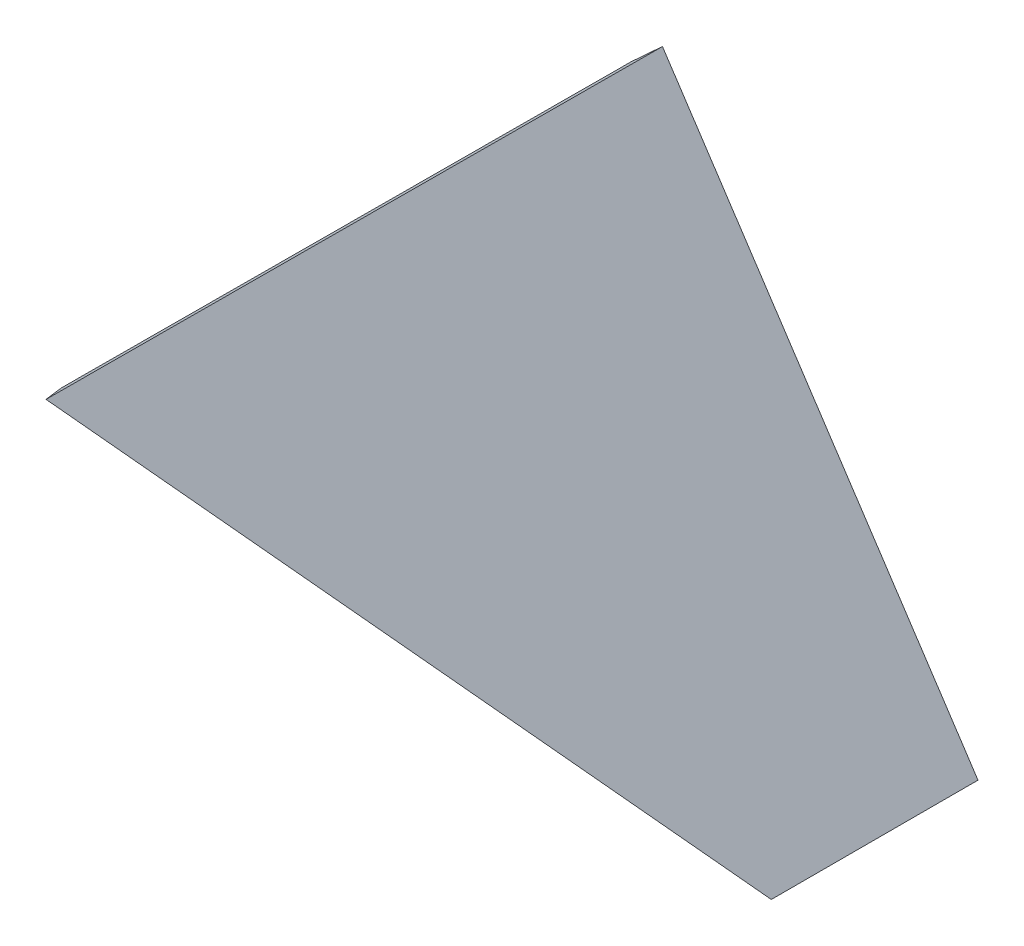
ISO-10303-21;
HEADER;
FILE_DESCRIPTION(('STEP AP214'),'2;1');
FILE_NAME('part.step','',(''),(''),'','','');
FILE_SCHEMA(('AUTOMOTIVE_DESIGN { 1 0 10303 214 1 1 1 1 }'));
ENDSEC;
DATA;
#1=APPLICATION_CONTEXT('core data for automotive mechanical design processes');
#2=APPLICATION_PROTOCOL_DEFINITION('international standard','automotive_design',2000,#1);
#3=PRODUCT_CONTEXT('',#1,'mechanical');
#4=PRODUCT('Part','Part','',(#3));
#5=PRODUCT_RELATED_PRODUCT_CATEGORY('part','',(#4));
#6=PRODUCT_DEFINITION_FORMATION('','',#4);
#7=PRODUCT_DEFINITION_CONTEXT('part definition',#1,'design');
#8=PRODUCT_DEFINITION('design','',#6,#7);
#9=PRODUCT_DEFINITION_SHAPE('','',#8);
#10=(LENGTH_UNIT() NAMED_UNIT(*) SI_UNIT(.MILLI.,.METRE.));
#11=(NAMED_UNIT(*) PLANE_ANGLE_UNIT() SI_UNIT($,.RADIAN.));
#12=(NAMED_UNIT(*) SI_UNIT($,.STERADIAN.) SOLID_ANGLE_UNIT());
#13=UNCERTAINTY_MEASURE_WITH_UNIT(LENGTH_MEASURE(1.E-05),#10,'distance_accuracy_value','');
#14=(GEOMETRIC_REPRESENTATION_CONTEXT(3) GLOBAL_UNCERTAINTY_ASSIGNED_CONTEXT((#13)) GLOBAL_UNIT_ASSIGNED_CONTEXT((#10,
#11,#12)) REPRESENTATION_CONTEXT('',''));
#15=CARTESIAN_POINT('',(0.,0.,0.));
#16=DIRECTION('',(0.,0.,1.));
#17=DIRECTION('',(1.,0.,0.));
#18=AXIS2_PLACEMENT_3D('',#15,#16,#17);
#19=CARTESIAN_POINT('',(-204.997061337424,361.646186737307,597.997319736598));
#20=DIRECTION('',(0.463959634932344,0.757671489646815,-0.458993868074316));
#21=DIRECTION('',(0.852811638118469,-0.522218641844289,0.));
#22=AXIS2_PLACEMENT_3D('',#19,#20,#21);
#23=PLANE('',#22);
#24=CARTESIAN_POINT('',(-43.5986691713442,24.4995963224331,204.606399203203));
#25=CARTESIAN_POINT('',(-42.8754936064784,25.0782118388571,206.292532298129));
#26=CARTESIAN_POINT('',(-42.1524105346302,25.6568941419068,207.978682145557));
#27=CARTESIAN_POINT('',(-40.3449339855553,27.1037668232176,212.194098677706));
#28=CARTESIAN_POINT('',(-39.2606560904031,27.9720406498919,214.723386280062));
#29=CARTESIAN_POINT('',(-37.0925161758134,29.7088885572055,219.782036745745));
#30=CARTESIAN_POINT('',(-36.0086541563893,30.5774626378546,222.311399609074));
#31=CARTESIAN_POINT('',(-34.9249999999667,31.4461867373069,224.84079999998));
#32=B_SPLINE_CURVE_WITH_KNOTS('',3,(#24,#25,#26,#27,#28,#29,#30,#31),.UNSPECIFIED.,.F.,.F.,(4,2,
2,4),(0.,5.77125745721898,14.4281439110805,23.0850306444132),.UNSPECIFIED.);
#33=CARTESIAN_POINT('',(-43.5986691866717,24.4995963101696,204.606399132983));
#34=VERTEX_POINT('',#33);
#35=CARTESIAN_POINT('',(-34.9249999999667,31.4461867373068,224.84079999998));
#36=VERTEX_POINT('',#35);
#37=EDGE_CURVE('E104',#34,#36,#32,.T.);
#38=ORIENTED_EDGE('',*,*,#37,.T.);
#39=DIRECTION('',(0.523067455693984,-0.652478989348315,-0.548335303671779));
#40=VECTOR('',#39,1.);
#41=CARTESIAN_POINT('',(-299.633713521394,361.646186737307,502.336811715639));
#42=LINE('',#41,#40);
#43=CARTESIAN_POINT('',(-299.633713521394,361.646186737307,502.336811715639));
#44=VERTEX_POINT('',#43);
#45=EDGE_CURVE('E73',#44,#36,#42,.T.);
#46=ORIENTED_EDGE('',*,*,#45,.F.);
#47=CARTESIAN_POINT('',(-299.547718591971,361.715502966095,502.538158863852));
#48=CARTESIAN_POINT('',(-300.99527731455,360.548696010176,499.148864825092));
#49=CARTESIAN_POINT('',(-302.442878707178,359.381919809434,495.759578422902));
#50=CARTESIAN_POINT('',(-304.614344820088,357.631801655116,490.675660278542));
#51=CARTESIAN_POINT('',(-305.338177528633,357.048436627943,488.981022806328));
#52=CARTESIAN_POINT('',(-306.785864290084,355.881721958292,485.591751682482));
#53=CARTESIAN_POINT('',(-307.509718342989,355.298372315813,483.897118030849));
#54=CARTESIAN_POINT('',(-308.233583069537,354.715030366939,482.202486290103));
#55=B_SPLINE_CURVE_WITH_KNOTS('',3,(#47,#48,#49,#50,#51,#52,#53,#54),.UNSPECIFIED.,.F.,.F.,(4,2,
2,4),(0.,11.5973104323324,17.3959656524751,23.1946208737148),.UNSPECIFIED.);
#56=CARTESIAN_POINT('',(-308.233583075701,354.71503036197,482.202486275137));
#57=VERTEX_POINT('',#56);
#58=EDGE_CURVE('E105',#44,#57,#55,.T.);
#59=ORIENTED_EDGE('',*,*,#58,.T.);
#60=CARTESIAN_POINT('',(-308.233583075947,354.715030361773,482.202486275096));
#61=CARTESIAN_POINT('',(-297.204705607979,340.956005258964,470.638351215406));
#62=CARTESIAN_POINT('',(-286.175921181311,327.196982025532,459.074125193642));
#63=CARTESIAN_POINT('',(-264.118618146245,299.678940859667,435.945413206485));
#64=CARTESIAN_POINT('',(-253.090099537848,285.919922927234,424.380927241092));
#65=CARTESIAN_POINT('',(-231.033407951684,258.401894021287,401.251617427606));
#66=CARTESIAN_POINT('',(-220.005234973917,244.642883047772,389.686793579513));
#67=CARTESIAN_POINT('',(-203.463333170109,224.004373818464,372.33920821136));
#68=CARTESIAN_POINT('',(-197.949425521045,217.124871957667,366.556621498114));
#69=CARTESIAN_POINT('',(-186.92175272265,203.365871104043,354.991308764435));
#70=CARTESIAN_POINT('',(-181.407987573319,196.486372111215,349.208582744));
#71=CARTESIAN_POINT('',(-164.866945196782,175.847879682877,331.860156384336));
#72=CARTESIAN_POINT('',(-153.839921496693,162.088891366016,320.294208224598));
#73=CARTESIAN_POINT('',(-131.7868684289,134.570934893791,297.161340096278));
#74=CARTESIAN_POINT('',(-120.760839061193,120.811966738427,285.594420127701));
#75=CARTESIAN_POINT('',(-104.22298431448,100.173538546135,268.242877687739));
#76=CARTESIAN_POINT('',(-98.7105642332402,93.2940664266603,262.458836407627));
#77=CARTESIAN_POINT('',(-87.6862459644717,79.5351328318864,250.890243878002));
#78=CARTESIAN_POINT('',(-82.1743477769424,72.6556713565874,245.105692628491));
#79=CARTESIAN_POINT('',(-71.1512336275485,58.8967622574677,233.535923387881));
#80=CARTESIAN_POINT('',(-65.6400176656926,52.017314633647,227.750705396774));
#81=CARTESIAN_POINT('',(-54.6185498672544,38.2584391571061,216.179327495198));
#82=CARTESIAN_POINT('',(-49.108298030678,31.3790113043858,210.393167584724));
#83=CARTESIAN_POINT('',(-43.5986692051831,24.4995962953361,204.606399124266));
#84=B_SPLINE_CURVE_WITH_KNOTS('',3,(#60,#61,#62,#63,#64,#65,#66,#67,#68,#69,#70,#71,#72,#73,#74,
#75,#76,#77,#78,#79,#80,#81,#82,#83),.UNSPECIFIED.,.F.,.F.,(4,2,2,2,2,2,2,2,2,2,2,4),(0.,
63.2620357498322,126.524071717889,189.786107682514,221.417125568468,253.048143487042,
316.310181938098,379.572220176318,411.203239867129,442.834259501272,474.465279543088,
506.096299780967),.UNSPECIFIED.);
#85=EDGE_CURVE('E80',#57,#34,#84,.T.);
#86=ORIENTED_EDGE('',*,*,#85,.T.);
#87=EDGE_LOOP('',(#38,#46,#59,#86));
#88=FACE_BOUND('',#87,.T.);
#89=ADVANCED_FACE('F41',(#88),#23,.F.);
#90=CARTESIAN_POINT('',(-202.216329949319,361.646186737307,-51.3842000000199));
#91=DIRECTION('',(0.599439623726799,0.526033966837793,0.60329130877145));
#92=DIRECTION('',(0.709367617412239,0.,-0.70483869315389));
#93=AXIS2_PLACEMENT_3D('',#90,#91,#92);
#94=PLANE('',#93);
#95=CARTESIAN_POINT('',(-34.9249999999667,31.4461867373069,70.307200000003));
#96=CARTESIAN_POINT('',(-35.7999722328495,30.7499617881434,71.7836525610129));
#97=CARTESIAN_POINT('',(-36.6748689530717,30.0536476831162,73.2601078300541));
#98=CARTESIAN_POINT('',(-38.4245113928691,28.6608412173291,76.2130237598919));
#99=CARTESIAN_POINT('',(-39.2992571124443,27.9643488565692,77.6894844206885));
#100=CARTESIAN_POINT('',(-41.3221397180308,26.3533388219411,81.1041564988629));
#101=CARTESIAN_POINT('',(-42.4702220051201,25.4387567039523,83.0423698573248));
#102=CARTESIAN_POINT('',(-43.6181742332127,24.5240211053081,84.9805878131046));
#103=B_SPLINE_CURVE_WITH_KNOTS('',3,(#95,#96,#97,#98,#99,#100,#101,#102),.UNSPECIFIED.,.F.,.F.,
(4,2,2,4),(0.,5.55625410944197,11.1125082188783,18.4064110991982),.UNSPECIFIED.);
#104=CARTESIAN_POINT('',(-34.9249999999667,31.4461867373069,70.3072000000032));
#105=VERTEX_POINT('',#104);
#106=CARTESIAN_POINT('',(-43.6181742499442,24.5240210919572,84.9805878781549));
#107=VERTEX_POINT('',#106);
#108=EDGE_CURVE('E244',#105,#107,#103,.T.);
#109=ORIENTED_EDGE('',*,*,#108,.T.);
#110=CARTESIAN_POINT('',(-43.6181742671146,24.5240210782811,84.980587870356));
#111=CARTESIAN_POINT('',(-50.0747826552356,32.6325661353417,84.325807645316));
#112=CARTESIAN_POINT('',(-56.5310034070046,40.7413704366253,83.6704162133009));
#113=CARTESIAN_POINT('',(-69.442860723978,56.9593695908719,82.3587123546937));
#114=CARTESIAN_POINT('',(-75.8984972891851,65.0685644438331,81.7023999281061));
#115=CARTESIAN_POINT('',(-88.8093773194194,81.2872167649613,80.3891554997155));
#116=CARTESIAN_POINT('',(-95.2646207844502,89.3966742331258,79.7322234979184));
#117=CARTESIAN_POINT('',(-108.174815285874,105.615784600871,78.4178985281675));
#118=CARTESIAN_POINT('',(-114.629766322266,113.725437500453,77.7605055602131));
#119=CARTESIAN_POINT('',(-133.994296149984,138.054611666937,75.7878175638729));
#120=CARTESIAN_POINT('',(-146.903551932842,154.274348744527,74.4720134152308));
#121=CARTESIAN_POINT('',(-172.721545368626,186.714169101221,71.83958842896));
#122=CARTESIAN_POINT('',(-185.630283021549,202.934252380327,70.5229675913274));
#123=CARTESIAN_POINT('',(-216.520495428877,241.749191720122,67.3716554746937));
#124=CARTESIAN_POINT('',(-234.501811170469,264.34415398212,65.5367135968958));
#125=CARTESIAN_POINT('',(-261.473491373243,298.236793150696,62.7838385392403));
#126=CARTESIAN_POINT('',(-270.464002498547,309.534372118356,61.8661364840161));
#127=CARTESIAN_POINT('',(-288.444944182983,332.129583850013,60.0306054145787));
#128=CARTESIAN_POINT('',(-297.435374742116,343.42721661401,59.1127764003656));
#129=CARTESIAN_POINT('',(-306.42577362485,354.724870530214,58.1948974685292));
#130=B_SPLINE_CURVE_WITH_KNOTS('',3,(#110,#111,#112,#113,#114,#115,#116,#117,#118,#119,#120,
#121,#122,#123,#124,#125,#126,#127,#128,#129),.UNSPECIFIED.,.F.,.F.,(4,2,2,2,2,2,2,2,2,4),(0.,
31.1574273887616,62.3148546271705,93.4722815660201,124.629708548259,186.944561195096,
249.259414133352,336.064042006871,379.466355550797,422.86866908636),.UNSPECIFIED.);
#131=CARTESIAN_POINT('',(-306.425773624633,354.724870530387,58.1948974685609));
#132=VERTEX_POINT('',#131);
#133=EDGE_CURVE('E88',#107,#132,#130,.T.);
#134=ORIENTED_EDGE('',*,*,#133,.T.);
#135=CARTESIAN_POINT('',(-306.42577362485,354.724870530214,58.1948974685292));
#136=CARTESIAN_POINT('',(-305.539689122175,355.425263828938,56.7037690317879));
#137=CARTESIAN_POINT('',(-304.653595916762,356.125646827878,55.2126409286667));
#138=CARTESIAN_POINT('',(-302.881392100134,357.52639222545,52.2303853899867));
#139=CARTESIAN_POINT('',(-301.99528148892,358.226754624082,50.7392579544279));
#140=CARTESIAN_POINT('',(-299.933179581515,359.856554780891,47.2692331046374));
#141=CARTESIAN_POINT('',(-298.757181660246,360.785984697943,45.2903359446144));
#142=CARTESIAN_POINT('',(-297.581168410451,361.715396472482,43.3114393731183));
#143=B_SPLINE_CURVE_WITH_KNOTS('',3,(#135,#136,#137,#138,#139,#140,#141,#142),.UNSPECIFIED.,.F.,
.F.,(4,2,2,4),(0.,5.61181296927124,11.2236259385425,18.6711493830715),.UNSPECIFIED.);
#144=CARTESIAN_POINT('',(-297.668741542232,361.646186737307,43.4588001512512));
#145=VERTEX_POINT('',#144);
#146=EDGE_CURVE('E100',#132,#145,#143,.T.);
#147=ORIENTED_EDGE('',*,*,#146,.T.);
#148=CARTESIAN_POINT('',(-34.9249999999667,31.446186737307,70.3072000000032));
#149=CARTESIAN_POINT('',(-122.506247180722,141.512853403974,61.3577333837525));
#150=CARTESIAN_POINT('',(-210.087494361477,251.57952007064,52.4082667675019));
#151=CARTESIAN_POINT('',(-297.668741542232,361.646186737307,43.4588001512512));
#152=B_SPLINE_CURVE_WITH_KNOTS('',3,(#148,#149,#150,#151),.UNSPECIFIED.,.F.,.F.,(4,4),(0.,1.),.UNSPECIFIED.);
#153=EDGE_CURVE('E61',#145,#105,#152,.F.);
#154=ORIENTED_EDGE('',*,*,#153,.T.);
#155=EDGE_LOOP('',(#109,#134,#147,#154));
#156=FACE_BOUND('',#155,.T.);
#157=ADVANCED_FACE('F101',(#156),#94,.F.);
#158=CARTESIAN_POINT('',(-34.9249999999667,31.4461867373069,224.84079999998));
#159=CARTESIAN_POINT('',(-34.9249999999667,31.4461867373069,173.329599999988));
#160=CARTESIAN_POINT('',(-34.9249999999667,31.446186737307,121.818399999995));
#161=CARTESIAN_POINT('',(-34.9249999999667,31.446186737307,70.3072000000032));
#162=CARTESIAN_POINT('',(-123.161237840443,141.512853403973,317.339470571866));
#163=CARTESIAN_POINT('',(-122.942907620536,141.512853403973,232.012224842495));
#164=CARTESIAN_POINT('',(-122.724577400629,141.512853403974,146.684979113124));
#165=CARTESIAN_POINT('',(-122.506247180722,141.512853403974,61.3577333837525));
#166=CARTESIAN_POINT('',(-211.397475680918,251.57952007064,409.838141143753));
#167=CARTESIAN_POINT('',(-210.960815241104,251.57952007064,290.694849685003));
#168=CARTESIAN_POINT('',(-210.524154801291,251.57952007064,171.551558226252));
#169=CARTESIAN_POINT('',(-210.087494361477,251.57952007064,52.4082667675019));
#170=CARTESIAN_POINT('',(-299.633713521394,361.646186737307,502.336811715639));
#171=CARTESIAN_POINT('',(-298.978722861673,361.646186737307,349.37747452751));
#172=CARTESIAN_POINT('',(-298.323732201952,361.646186737307,196.418137339381));
#173=CARTESIAN_POINT('',(-297.668741542232,361.646186737307,43.4588001512512));
#174=B_SPLINE_SURFACE_WITH_KNOTS('',3,3,((#158,#159,#160,#161),(#162,#163,#164,#165),(#166,#167,
#168,#169),(#170,#171,#172,#173)),.UNSPECIFIED.,.F.,.F.,.F.,(4,4),(4,4),(0.,1.),(0.,1.),.UNSPECIFIED.);
#175=CARTESIAN_POINT('',(-34.9249999999667,31.446186737307,64.9217418010259));
#176=CARTESIAN_POINT('',(-34.9249999999667,31.446186737307,65.4679913240455));
#177=CARTESIAN_POINT('',(-34.9249999999667,31.446186737307,66.0142408470651));
#178=CARTESIAN_POINT('',(-34.9249999999667,31.446186737307,66.5604903700848));
#179=CARTESIAN_POINT('',(-34.9249999999667,31.446186737307,67.8093935800576));
#180=CARTESIAN_POINT('',(-34.9249999999667,31.446186737307,69.0582967900304));
#181=CARTESIAN_POINT('',(-34.9249999999667,31.446186737307,70.3072000000032));
#182=CARTESIAN_POINT('',(-34.9249999999667,31.446186737307,121.818399999996));
#183=CARTESIAN_POINT('',(-34.9249999999667,31.4461867373069,173.329599999988));
#184=CARTESIAN_POINT('',(-34.9249999999667,31.4461867373069,224.84079999998));
#185=CARTESIAN_POINT('',(-34.9249999999667,31.4461867373069,226.164807980079));
#186=CARTESIAN_POINT('',(-34.9249999999667,31.4461867373069,227.488815960177));
#187=CARTESIAN_POINT('',(-34.9249999999667,31.4461867373069,228.812823940275));
#188=CARTESIAN_POINT('',(-34.9249999999667,31.4461867373069,229.353665052176));
#189=CARTESIAN_POINT('',(-34.9249999999667,31.4461867373069,229.894506164077));
#190=CARTESIAN_POINT('',(-34.9249999999667,31.4461867373069,230.435347275977));
#191=B_SPLINE_CURVE_WITH_KNOTS('',3,(#175,#176,#177,#178,#179,#180,#181,#182,#183,#184,#185,
#186,#187,#188,#189,#190),.UNSPECIFIED.,.F.,.F.,(4,3,3,3,3,4),(-0.0362027887527238,
-0.0255983081151202,-0.00135303310749102,0.998646966892509,1.02435026986543,1.03484975564523),.UNSPECIFIED.);
#192=EDGE_CURVE('E11',#105,#36,#191,.T.);
#193=CARTESIAN_POINT('',(-299.653363241186,361.646186737307,506.925591831283));
#194=CARTESIAN_POINT('',(-299.646813334589,361.646186737307,505.395998459402));
#195=CARTESIAN_POINT('',(-299.640263427991,361.646186737307,503.866405087521));
#196=CARTESIAN_POINT('',(-299.633713521394,361.646186737307,502.336811715639));
#197=CARTESIAN_POINT('',(-298.978722861673,361.646186737307,349.37747452751));
#198=CARTESIAN_POINT('',(-298.323732201952,361.646186737307,196.418137339381));
#199=CARTESIAN_POINT('',(-297.668741542232,361.646186737307,43.4588001512512));
#200=CARTESIAN_POINT('',(-297.662191635634,361.646186737307,41.9292067793699));
#201=CARTESIAN_POINT('',(-297.655641729037,361.646186737307,40.3996134074886));
#202=CARTESIAN_POINT('',(-297.64909182244,361.646186737307,38.8700200356073));
#203=B_SPLINE_CURVE_WITH_KNOTS('',3,(#193,#194,#195,#196,#197,#198,#199,#200,#201,#202),
.UNSPECIFIED.,.F.,.F.,(4,3,3,4),(-0.01,0.,1.,1.01),.UNSPECIFIED.);
#204=EDGE_CURVE('E54',#44,#145,#203,.T.);
#205=ORIENTED_EDGE('',*,*,#45,.T.);
#206=ORIENTED_EDGE('',*,*,#192,.F.);
#207=ORIENTED_EDGE('',*,*,#153,.F.);
#208=ORIENTED_EDGE('',*,*,#204,.F.);
#209=EDGE_LOOP('',(#205,#206,#207,#208));
#210=FACE_BOUND('',#209,.T.);
#211=ADVANCED_FACE('F95',(#210),#174,.F.);
#212=CARTESIAN_POINT('',(-43.5944602670922,24.4943440282974,230.435347275977));
#213=CARTESIAN_POINT('',(-43.594548393661,24.4944539581619,229.894506164077));
#214=CARTESIAN_POINT('',(-43.5946365202298,24.4945638880263,229.353665052176));
#215=CARTESIAN_POINT('',(-43.5947246467985,24.4946738178908,228.812823940275));
#216=CARTESIAN_POINT('',(-43.5949403853541,24.494942932081,227.488815960177));
#217=CARTESIAN_POINT('',(-43.5951561239097,24.4952120462711,226.164807980078));
#218=CARTESIAN_POINT('',(-43.5953718624653,24.4954811604613,224.84079999998));
#219=CARTESIAN_POINT('',(-43.6037652800673,24.505951184116,173.329599999988));
#220=CARTESIAN_POINT('',(-43.6121641093435,24.5164668180097,121.818399999996));
#221=CARTESIAN_POINT('',(-43.6205680635586,24.5270283852065,70.3072000000032));
#222=CARTESIAN_POINT('',(-43.6207718197397,24.5272844533078,69.0582967900304));
#223=CARTESIAN_POINT('',(-43.6209755759208,24.527540521409,67.8093935800576));
#224=CARTESIAN_POINT('',(-43.6211793321019,24.5277965895102,66.5604903700848));
#225=CARTESIAN_POINT('',(-43.6212684516717,24.527908589445,66.0142408470651));
#226=CARTESIAN_POINT('',(-43.6213575712414,24.5280205893799,65.4679913240455));
#227=CARTESIAN_POINT('',(-43.6214466908112,24.5281325893147,64.9217418010259));
#228=CARTESIAN_POINT('',(-34.9249999999667,31.4461867373069,230.435347275977));
#229=CARTESIAN_POINT('',(-34.9249999999667,31.4461867373069,229.894506164077));
#230=CARTESIAN_POINT('',(-34.9249999999667,31.4461867373069,229.353665052176));
#231=CARTESIAN_POINT('',(-34.9249999999667,31.4461867373069,228.812823940275));
#232=CARTESIAN_POINT('',(-34.9249999999667,31.4461867373069,227.488815960177));
#233=CARTESIAN_POINT('',(-34.9249999999667,31.4461867373069,226.164807980079));
#234=CARTESIAN_POINT('',(-34.9249999999667,31.4461867373069,224.84079999998));
#235=CARTESIAN_POINT('',(-34.9249999999667,31.4461867373069,173.329599999988));
#236=CARTESIAN_POINT('',(-34.9249999999667,31.446186737307,121.818399999996));
#237=CARTESIAN_POINT('',(-34.9249999999667,31.446186737307,70.3072000000032));
#238=CARTESIAN_POINT('',(-34.9249999999667,31.446186737307,69.0582967900304));
#239=CARTESIAN_POINT('',(-34.9249999999667,31.446186737307,67.8093935800576));
#240=CARTESIAN_POINT('',(-34.9249999999667,31.446186737307,66.5604903700848));
#241=CARTESIAN_POINT('',(-34.9249999999667,31.446186737307,66.0142408470651));
#242=CARTESIAN_POINT('',(-34.9249999999667,31.446186737307,65.4679913240455));
#243=CARTESIAN_POINT('',(-34.9249999999667,31.446186737307,64.9217418010259));
#244=B_SPLINE_SURFACE_WITH_KNOTS('',1,3,((#212,#213,#214,#215,#216,#217,#218,#219,#220,#221,
#222,#223,#224,#225,#226,#227),(#228,#229,#230,#231,#232,#233,#234,#235,#236,#237,#238,#239,
#240,#241,#242,#243)),.UNSPECIFIED.,.F.,.F.,.F.,(2,2),(4,3,3,3,3,4),(0.,1.),
(-0.0362027887527238,-0.0257033029729183,0.,1.,1.02424527500763,1.03484975564523),.UNSPECIFIED.);
#245=CARTESIAN_POINT('',(-43.6181742670075,24.5240210781465,84.980587876856));
#246=CARTESIAN_POINT('',(-43.6173611645776,24.5229999466876,89.9649966787924));
#247=CARTESIAN_POINT('',(-43.6165481104499,24.5219792451034,94.9494054808248));
#248=CARTESIAN_POINT('',(-43.6149220992143,24.5199387009642,104.918223085227));
#249=CARTESIAN_POINT('',(-43.6141091421065,24.5189188584093,109.902631887597));
#250=CARTESIAN_POINT('',(-43.6124833253259,24.5168800316092,119.871449492233));
#251=CARTESIAN_POINT('',(-43.6116704656533,24.5158610473639,124.855858294499));
#252=CARTESIAN_POINT('',(-43.6100448444469,24.5138239368266,134.824675899031));
#253=CARTESIAN_POINT('',(-43.6092320829132,24.5128058105344,139.809084701297));
#254=CARTESIAN_POINT('',(-43.6076066583001,24.5107704150611,149.777902305856));
#255=CARTESIAN_POINT('',(-43.6067939952207,24.5097531458799,154.762311108148));
#256=CARTESIAN_POINT('',(-43.6051687682831,24.5077194643531,164.731128712654));
#257=CARTESIAN_POINT('',(-43.6043562044249,24.5067030520075,169.715537514868));
#258=CARTESIAN_POINT('',(-43.6027311761623,24.504671083209,179.684355119374));
#259=CARTESIAN_POINT('',(-43.6019187117578,24.503655526756,184.668763921666));
#260=CARTESIAN_POINT('',(-43.6002938831419,24.5016252694353,194.63758152616));
#261=CARTESIAN_POINT('',(-43.5994815189305,24.5006105685676,199.621990328361));
#262=CARTESIAN_POINT('',(-43.5986692051853,24.4995962953387,204.606399130657));
#263=B_SPLINE_CURVE_WITH_KNOTS('',3,(#245,#246,#247,#248,#249,#250,#251,#252,#253,#254,#255,
#256,#257,#258,#259,#260,#261,#262),.UNSPECIFIED.,.F.,.F.,(4,2,2,2,2,2,2,2,4),(0.,
14.9532269185617,29.9064538375606,44.8596807556742,59.8129076732139,74.7661345902586,
89.719361506496,104.672588422396,119.625815337451),.UNSPECIFIED.);
#264=EDGE_CURVE('E228',#107,#34,#263,.T.);
#265=ORIENTED_EDGE('',*,*,#108,.F.);
#266=ORIENTED_EDGE('',*,*,#192,.T.);
#267=ORIENTED_EDGE('',*,*,#37,.F.);
#268=ORIENTED_EDGE('',*,*,#264,.F.);
#269=EDGE_LOOP('',(#265,#266,#267,#268));
#270=FACE_BOUND('',#269,.T.);
#271=ADVANCED_FACE('F128',(#270),#244,.F.);
#272=CARTESIAN_POINT('',(-308.338834651582,354.714458281584,506.888399576442));
#273=CARTESIAN_POINT('',(-308.332313032208,354.714493727078,505.358806083431));
#274=CARTESIAN_POINT('',(-308.325791412834,354.714529172573,503.82921259042));
#275=CARTESIAN_POINT('',(-308.31926979346,354.714564618068,502.29961909741));
#276=CARTESIAN_POINT('',(-307.667107856077,354.718109167544,349.340269796344));
#277=CARTESIAN_POINT('',(-307.014946512745,354.72165891179,196.380920492734));
#278=CARTESIAN_POINT('',(-306.362785752443,354.725213863131,43.4215711866285));
#279=CARTESIAN_POINT('',(-306.35626414484,354.725249412644,41.8919776935675));
#280=CARTESIAN_POINT('',(-306.349742537237,354.725284962158,40.3623842005064));
#281=CARTESIAN_POINT('',(-306.343220929634,354.725320511671,38.8327907074453));
#282=CARTESIAN_POINT('',(-299.653363241186,361.646186737307,506.925591831283));
#283=CARTESIAN_POINT('',(-299.646813334589,361.646186737307,505.395998459402));
#284=CARTESIAN_POINT('',(-299.640263427991,361.646186737307,503.866405087521));
#285=CARTESIAN_POINT('',(-299.633713521394,361.646186737307,502.336811715639));
#286=CARTESIAN_POINT('',(-298.978722861673,361.646186737307,349.37747452751));
#287=CARTESIAN_POINT('',(-298.323732201952,361.646186737307,196.418137339381));
#288=CARTESIAN_POINT('',(-297.668741542232,361.646186737307,43.4588001512512));
#289=CARTESIAN_POINT('',(-297.662191635634,361.646186737307,41.9292067793699));
#290=CARTESIAN_POINT('',(-297.655641729037,361.646186737307,40.3996134074886));
#291=CARTESIAN_POINT('',(-297.64909182244,361.646186737307,38.8700200356073));
#292=CARTESIAN_POINT('',(-299.566508527082,361.715504021864,506.925963753832));
#293=CARTESIAN_POINT('',(-299.559958337612,361.715503667409,505.396370383162));
#294=CARTESIAN_POINT('',(-299.553408148143,361.715503312954,503.866777012492));
#295=CARTESIAN_POINT('',(-299.546857958674,361.715502958499,502.337183641822));
#296=CARTESIAN_POINT('',(-298.891839011729,361.715467513004,349.377846574821));
#297=CARTESIAN_POINT('',(-298.236820058845,361.715432015562,196.418509507847));
#298=CARTESIAN_POINT('',(-297.581801100129,361.715396466049,43.4591724408975));
#299=CARTESIAN_POINT('',(-297.575250910542,361.715396110553,41.929579070228));
#300=CARTESIAN_POINT('',(-297.568700720955,361.715395755058,40.3999856995585));
#301=CARTESIAN_POINT('',(-297.562150531368,361.715395399563,38.870392328889));
#302=B_SPLINE_SURFACE_WITH_KNOTS('',1,3,((#272,#273,#274,#275,#276,#277,#278,#279,#280,#281),
(#282,#283,#284,#285,#286,#287,#288,#289,#290,#291),(#292,#293,#294,#295,#296,#297,#298,#299,
#300,#301)),.UNSPECIFIED.,.F.,.F.,.F.,(2,1,2),(4,3,3,4),(0.,1.,1.01),(-0.01,0.,1.,1.01),.UNSPECIFIED.);
#303=CARTESIAN_POINT('',(-308.233583076261,354.715030362169,482.202486274383));
#304=CARTESIAN_POINT('',(-308.158257619112,354.715439813857,464.535503407991));
#305=CARTESIAN_POINT('',(-308.082932170127,354.715849335159,446.868520541565));
#306=CARTESIAN_POINT('',(-307.932281288188,354.716668516704,411.534554808368));
#307=CARTESIAN_POINT('',(-307.856955855234,354.717078176947,393.867571941597));
#308=CARTESIAN_POINT('',(-307.706305005063,354.717897636086,358.533606208018));
#309=CARTESIAN_POINT('',(-307.630979587846,354.718307434982,340.866623341211));
#310=CARTESIAN_POINT('',(-307.480328768992,354.719127171309,305.532657607534));
#311=CARTESIAN_POINT('',(-307.405003367356,354.71953710874,287.865674740664));
#312=CARTESIAN_POINT('',(-307.254352579743,354.720357122321,252.531709006645));
#313=CARTESIAN_POINT('',(-307.179027193766,354.72076719847,234.864726139496));
#314=CARTESIAN_POINT('',(-307.028376437992,354.721587490215,199.530760405303));
#315=CARTESIAN_POINT('',(-306.953051068194,354.721997705811,181.863777538259));
#316=CARTESIAN_POINT('',(-306.802400343458,354.722818274877,146.529811803933));
#317=CARTESIAN_POINT('',(-306.727074988519,354.723228628347,128.86282893665));
#318=CARTESIAN_POINT('',(-306.576424294719,354.724049474763,93.5288632027179));
#319=CARTESIAN_POINT('',(-306.501098955856,354.72445996771,75.8618803360683));
#320=CARTESIAN_POINT('',(-306.425773625635,354.724870531196,58.1948974693836));
#321=B_SPLINE_CURVE_WITH_KNOTS('',3,(#303,#304,#305,#306,#307,#308,#309,#310,#311,#312,#313,
#314,#315,#316,#317,#318,#319,#320),.UNSPECIFIED.,.F.,.F.,(4,2,2,2,2,2,2,2,4),(0.,
53.0014303509058,106.002860702654,159.004291054318,212.00572140598,265.007151758289,
318.008582110085,371.010012462417,424.011442812654),.UNSPECIFIED.);
#322=EDGE_CURVE('E241',#57,#132,#321,.T.);
#323=ORIENTED_EDGE('',*,*,#146,.F.);
#324=ORIENTED_EDGE('',*,*,#322,.F.);
#325=ORIENTED_EDGE('',*,*,#58,.F.);
#326=ORIENTED_EDGE('',*,*,#204,.T.);
#327=EDGE_LOOP('',(#323,#324,#325,#326));
#328=FACE_BOUND('',#327,.T.);
#329=ADVANCED_FACE('F108',(#328),#302,.T.);
#330=CARTESIAN_POINT('',(-34.9249999999667,31.4461867373069,228.812823940295));
#331=CARTESIAN_POINT('',(-34.9249999999667,31.4461867373069,228.00392796019));
#332=CARTESIAN_POINT('',(-34.9249999999667,31.4461867373069,227.195031980085));
#333=CARTESIAN_POINT('',(-34.9249999999667,31.4461867373069,225.87102399998));
#334=CARTESIAN_POINT('',(-34.9249999999667,31.4461867373069,225.35591199998));
#335=CARTESIAN_POINT('',(-34.9249999999667,31.4461867373069,173.329599999988));
#336=CARTESIAN_POINT('',(-34.9249999999667,31.446186737307,121.818399999995));
#337=CARTESIAN_POINT('',(-34.9249999999667,31.446186737307,69.7869368800033));
#338=CARTESIAN_POINT('',(-34.9249999999667,31.446186737307,69.2666737600033));
#339=CARTESIAN_POINT('',(-34.9249999999667,31.446186737307,66.168720257839));
#340=CARTESIAN_POINT('',(-34.9249999999667,31.446186737307,63.5910298756746));
#341=CARTESIAN_POINT('',(-34.9249999999667,31.446186737307,61.0133394935102));
#342=CARTESIAN_POINT('',(-123.178073263814,141.512853403973,323.91904671838));
#343=CARTESIAN_POINT('',(-123.174644758222,141.512853403973,322.579127126836));
#344=CARTESIAN_POINT('',(-123.171216252631,141.512853403973,321.239207535292));
#345=CARTESIAN_POINT('',(-123.165604444841,141.512853403973,319.046015486454));
#346=CARTESIAN_POINT('',(-123.163421142642,141.512853403973,318.19274302916));
#347=CARTESIAN_POINT('',(-122.942907620536,141.512853403973,232.012224842495));
#348=CARTESIAN_POINT('',(-122.724577400629,141.512853403974,146.684979113124));
#349=CARTESIAN_POINT('',(-122.504042045501,141.512853403974,60.4959282018859));
#350=CARTESIAN_POINT('',(-122.50183691028,141.512853403974,59.6341230200192));
#351=CARTESIAN_POINT('',(-122.488706234438,141.512853403974,54.502426617346));
#352=CARTESIAN_POINT('',(-122.477780693818,141.512853403974,50.2325353965394));
#353=CARTESIAN_POINT('',(-122.466855153198,141.512853403974,45.9626441757327));
#354=CARTESIAN_POINT('',(-211.431146527661,251.57952007064,419.025269496464));
#355=CARTESIAN_POINT('',(-211.424289516478,251.57952007064,417.154326293481));
#356=CARTESIAN_POINT('',(-211.417432505296,251.57952007064,415.283383090498));
#357=CARTESIAN_POINT('',(-211.406208889715,251.57952007064,412.221006972928));
#358=CARTESIAN_POINT('',(-211.401842285316,251.57952007064,411.02957405834));
#359=CARTESIAN_POINT('',(-210.960815241104,251.57952007064,290.694849685003));
#360=CARTESIAN_POINT('',(-210.524154801291,251.57952007064,171.551558226252));
#361=CARTESIAN_POINT('',(-210.083084091035,251.57952007064,51.2049195237685));
#362=CARTESIAN_POINT('',(-210.078673820592,251.57952007064,50.0015722800351));
#363=CARTESIAN_POINT('',(-210.05241246891,251.57952007064,42.8361329768529));
#364=CARTESIAN_POINT('',(-210.03056138767,251.57952007064,36.874040917404));
#365=CARTESIAN_POINT('',(-210.00871030643,251.57952007064,30.9119488579552));
#366=CARTESIAN_POINT('',(-299.684219791508,361.646186737307,514.131492274549));
#367=CARTESIAN_POINT('',(-299.673934274734,361.646186737307,511.729525460127));
#368=CARTESIAN_POINT('',(-299.66364875796,361.646186737307,509.327558645705));
#369=CARTESIAN_POINT('',(-299.646813334589,361.646186737307,505.395998459402));
#370=CARTESIAN_POINT('',(-299.640263427991,361.646186737307,503.866405087521));
#371=CARTESIAN_POINT('',(-298.978722861673,361.646186737307,349.37747452751));
#372=CARTESIAN_POINT('',(-298.323732201952,361.646186737307,196.418137339381));
#373=CARTESIAN_POINT('',(-297.662126136568,361.646186737307,41.9139108456511));
#374=CARTESIAN_POINT('',(-297.655510730905,361.646186737307,40.369021540051));
#375=CARTESIAN_POINT('',(-297.616118703382,361.646186737307,31.1698393363599));
#376=CARTESIAN_POINT('',(-297.583342081522,361.646186737307,23.5155464382688));
#377=CARTESIAN_POINT('',(-297.550565459662,361.646186737307,15.8612535401778));
#378=B_SPLINE_SURFACE_WITH_KNOTS('',3,3,((#330,#331,#332,#333,#334,#335,#336,#337,#338,#339,
#340,#341),(#342,#343,#344,#345,#346,#347,#348,#349,#350,#351,#352,#353),(#354,#355,#356,#357,
#358,#359,#360,#361,#362,#363,#364,#365),(#366,#367,#368,#369,#370,#371,#372,#373,#374,#375,
#376,#377)),.UNSPECIFIED.,.F.,.F.,.F.,(4,4),(4,2,2,2,2,4),(0.,1.),(-0.0257033029730483,-0.01,0.,
1.,1.0101,1.06014135764969),.UNSPECIFIED.);
#379=OFFSET_SURFACE('',#378,11.1125,.F.);
#380=ORIENTED_EDGE('',*,*,#133,.F.);
#381=ORIENTED_EDGE('',*,*,#264,.T.);
#382=ORIENTED_EDGE('',*,*,#85,.F.);
#383=ORIENTED_EDGE('',*,*,#322,.T.);
#384=EDGE_LOOP('',(#380,#381,#382,#383));
#385=FACE_BOUND('',#384,.T.);
#386=ADVANCED_FACE('F166',(#385),#379,.T.);
#387=CLOSED_SHELL('',(#89,#157,#211,#271,#329,#386));
#388=MANIFOLD_SOLID_BREP('B2',#387);
#389=ADVANCED_BREP_SHAPE_REPRESENTATION('',(#18,#388),#14);
#390=SHAPE_DEFINITION_REPRESENTATION(#9,#389);
ENDSEC;
END-ISO-10303-21;
